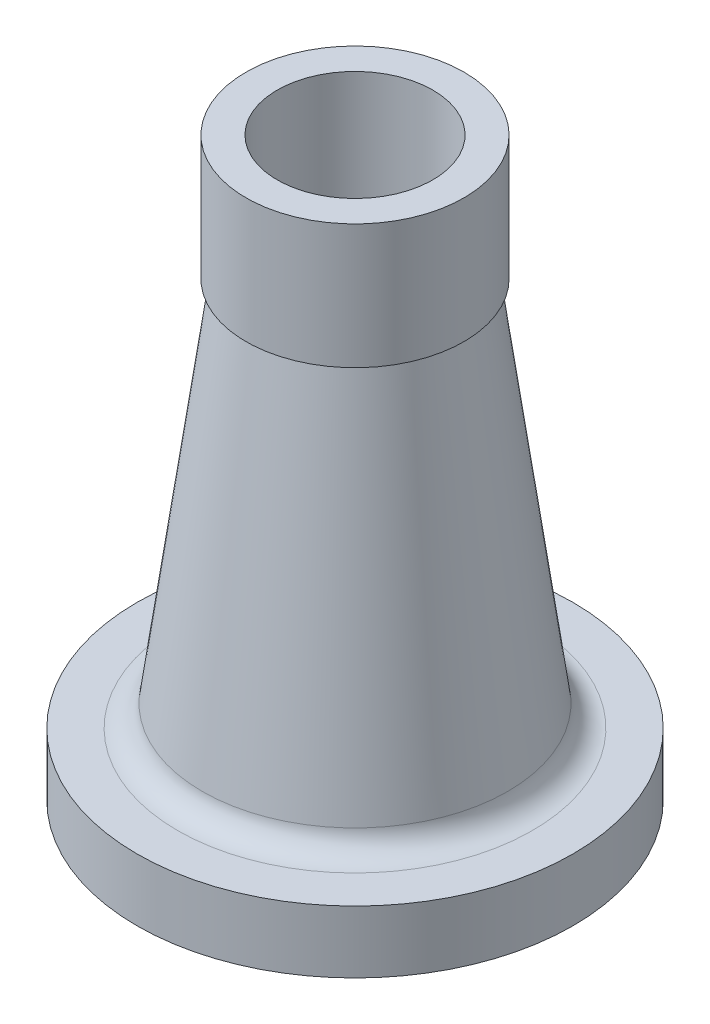
ISO-10303-21;
HEADER;
FILE_DESCRIPTION(('STEP AP214'),'2;1');
FILE_NAME('part.step','',(''),(''),'','','');
FILE_SCHEMA(('AUTOMOTIVE_DESIGN { 1 0 10303 214 1 1 1 1 }'));
ENDSEC;
DATA;
#1=APPLICATION_CONTEXT('core data for automotive mechanical design processes');
#2=APPLICATION_PROTOCOL_DEFINITION('international standard','automotive_design',2000,#1);
#3=PRODUCT_CONTEXT('',#1,'mechanical');
#4=PRODUCT('Part','Part','',(#3));
#5=PRODUCT_RELATED_PRODUCT_CATEGORY('part','',(#4));
#6=PRODUCT_DEFINITION_FORMATION('','',#4);
#7=PRODUCT_DEFINITION_CONTEXT('part definition',#1,'design');
#8=PRODUCT_DEFINITION('design','',#6,#7);
#9=PRODUCT_DEFINITION_SHAPE('','',#8);
#10=(LENGTH_UNIT() NAMED_UNIT(*) SI_UNIT(.MILLI.,.METRE.));
#11=(NAMED_UNIT(*) PLANE_ANGLE_UNIT() SI_UNIT($,.RADIAN.));
#12=(NAMED_UNIT(*) SI_UNIT($,.STERADIAN.) SOLID_ANGLE_UNIT());
#13=UNCERTAINTY_MEASURE_WITH_UNIT(LENGTH_MEASURE(1.E-05),#10,'distance_accuracy_value','');
#14=(GEOMETRIC_REPRESENTATION_CONTEXT(3) GLOBAL_UNCERTAINTY_ASSIGNED_CONTEXT((#13)) GLOBAL_UNIT_ASSIGNED_CONTEXT((#10,
#11,#12)) REPRESENTATION_CONTEXT('',''));
#15=CARTESIAN_POINT('',(0.,0.,0.));
#16=DIRECTION('',(0.,0.,1.));
#17=DIRECTION('',(1.,0.,0.));
#18=AXIS2_PLACEMENT_3D('',#15,#16,#17);
#19=CARTESIAN_POINT('',(0.,0.,0.));
#20=DIRECTION('',(0.,-1.,0.));
#21=DIRECTION('',(0.,0.,-1.));
#22=AXIS2_PLACEMENT_3D('',#19,#20,#21);
#23=CYLINDRICAL_SURFACE('',#22,50.);
#24=CARTESIAN_POINT('',(0.,0.,0.));
#25=DIRECTION('',(0.,-1.,0.));
#26=DIRECTION('',(0.,0.,-1.));
#27=AXIS2_PLACEMENT_3D('',#24,#25,#26);
#28=CIRCLE('',#27,50.);
#29=CARTESIAN_POINT('',(0.,0.,-50.));
#30=VERTEX_POINT('',#29);
#31=EDGE_CURVE('E56',#30,#30,#28,.T.);
#32=ORIENTED_EDGE('',*,*,#31,.T.);
#33=EDGE_LOOP('',(#32));
#34=FACE_BOUND('',#33,.T.);
#35=CARTESIAN_POINT('',(0.,3.,0.));
#36=DIRECTION('',(0.,-1.,0.));
#37=DIRECTION('',(0.,0.,-1.));
#38=AXIS2_PLACEMENT_3D('',#35,#36,#37);
#39=CIRCLE('',#38,50.);
#40=CARTESIAN_POINT('',(0.,3.,-50.));
#41=VERTEX_POINT('',#40);
#42=EDGE_CURVE('E95',#41,#41,#39,.T.);
#43=ORIENTED_EDGE('',*,*,#42,.F.);
#44=EDGE_LOOP('',(#43));
#45=FACE_BOUND('',#44,.T.);
#46=ADVANCED_FACE('F43',(#34,#45),#23,.F.);
#47=CARTESIAN_POINT('',(50.,0.,0.));
#48=DIRECTION('',(0.,-1.,0.));
#49=DIRECTION('',(0.,0.,-1.));
#50=AXIS2_PLACEMENT_3D('',#47,#48,#49);
#51=PLANE('',#50);
#52=CARTESIAN_POINT('',(0.,0.,0.));
#53=DIRECTION('',(0.,-1.,0.));
#54=DIRECTION('',(0.,0.,-1.));
#55=AXIS2_PLACEMENT_3D('',#52,#53,#54);
#56=CIRCLE('',#55,70.);
#57=CARTESIAN_POINT('',(0.,0.,-70.));
#58=VERTEX_POINT('',#57);
#59=EDGE_CURVE('E61',#58,#58,#56,.T.);
#60=ORIENTED_EDGE('',*,*,#59,.T.);
#61=EDGE_LOOP('',(#60));
#62=FACE_BOUND('',#61,.T.);
#63=ORIENTED_EDGE('',*,*,#31,.F.);
#64=EDGE_LOOP('',(#63));
#65=FACE_BOUND('',#64,.T.);
#66=ADVANCED_FACE('F104',(#62,#65),#51,.T.);
#67=CARTESIAN_POINT('',(0.,0.,0.));
#68=DIRECTION('',(0.,-1.,0.));
#69=DIRECTION('',(0.,0.,-1.));
#70=AXIS2_PLACEMENT_3D('',#67,#68,#69);
#71=CYLINDRICAL_SURFACE('',#70,70.);
#72=CARTESIAN_POINT('',(0.,20.,0.));
#73=DIRECTION('',(0.,-1.,0.));
#74=DIRECTION('',(0.,0.,-1.));
#75=AXIS2_PLACEMENT_3D('',#72,#73,#74);
#76=CIRCLE('',#75,70.);
#77=CARTESIAN_POINT('',(0.,20.,-70.));
#78=VERTEX_POINT('',#77);
#79=EDGE_CURVE('E67',#78,#78,#76,.T.);
#80=ORIENTED_EDGE('',*,*,#79,.T.);
#81=EDGE_LOOP('',(#80));
#82=FACE_BOUND('',#81,.T.);
#83=ORIENTED_EDGE('',*,*,#59,.F.);
#84=EDGE_LOOP('',(#83));
#85=FACE_BOUND('',#84,.T.);
#86=ADVANCED_FACE('F109',(#82,#85),#71,.T.);
#87=CARTESIAN_POINT('',(70.,20.,0.));
#88=DIRECTION('',(0.,1.,0.));
#89=DIRECTION('',(0.,0.,1.));
#90=AXIS2_PLACEMENT_3D('',#87,#88,#89);
#91=PLANE('',#90);
#92=CARTESIAN_POINT('',(0.,20.,0.));
#93=DIRECTION('',(0.,1.,0.));
#94=DIRECTION('',(0.,0.,1.));
#95=AXIS2_PLACEMENT_3D('',#92,#93,#94);
#96=CIRCLE('',#95,56.9856450256374);
#97=CARTESIAN_POINT('',(0.,20.,56.9856450256374));
#98=VERTEX_POINT('',#97);
#99=EDGE_CURVE('E51',#98,#98,#96,.F.);
#100=ORIENTED_EDGE('',*,*,#99,.T.);
#101=EDGE_LOOP('',(#100));
#102=FACE_BOUND('',#101,.T.);
#103=ORIENTED_EDGE('',*,*,#79,.F.);
#104=EDGE_LOOP('',(#103));
#105=FACE_BOUND('',#104,.T.);
#106=ADVANCED_FACE('F115',(#102,#105),#91,.T.);
#107=CARTESIAN_POINT('',(0.,20.,0.));
#108=DIRECTION('',(0.,-1.,0.));
#109=DIRECTION('',(0.,0.,-1.));
#110=AXIS2_PLACEMENT_3D('',#107,#108,#109);
#111=CONICAL_SURFACE('',#110,50.,0.135170698649009);
#112=CARTESIAN_POINT('',(0.,26.9219243634863,0.));
#113=DIRECTION('',(0.,-1.,0.));
#114=DIRECTION('',(0.,0.,-1.));
#115=AXIS2_PLACEMENT_3D('',#112,#113,#114);
#116=CIRCLE('',#115,49.0586182865659);
#117=CARTESIAN_POINT('',(0.,26.9219243634863,-49.0586182865659));
#118=VERTEX_POINT('',#117);
#119=EDGE_CURVE('E10',#118,#118,#116,.F.);
#120=ORIENTED_EDGE('',*,*,#119,.T.);
#121=EDGE_LOOP('',(#120));
#122=FACE_BOUND('',#121,.T.);
#123=CARTESIAN_POINT('',(0.,145.,0.));
#124=DIRECTION('',(0.,-1.,0.));
#125=DIRECTION('',(0.,0.,-1.));
#126=AXIS2_PLACEMENT_3D('',#123,#124,#125);
#127=CIRCLE('',#126,33.);
#128=CARTESIAN_POINT('',(0.,145.,-33.));
#129=VERTEX_POINT('',#128);
#130=EDGE_CURVE('E71',#129,#129,#127,.T.);
#131=ORIENTED_EDGE('',*,*,#130,.T.);
#132=EDGE_LOOP('',(#131));
#133=FACE_BOUND('',#132,.T.);
#134=ADVANCED_FACE('F119',(#122,#133),#111,.T.);
#135=CARTESIAN_POINT('',(33.,145.,0.));
#136=DIRECTION('',(0.,-1.,0.));
#137=DIRECTION('',(0.,0.,-1.));
#138=AXIS2_PLACEMENT_3D('',#135,#136,#137);
#139=PLANE('',#138);
#140=CARTESIAN_POINT('',(0.,145.,0.));
#141=DIRECTION('',(0.,-1.,0.));
#142=DIRECTION('',(0.,0.,-1.));
#143=AXIS2_PLACEMENT_3D('',#140,#141,#142);
#144=CIRCLE('',#143,35.);
#145=CARTESIAN_POINT('',(0.,145.,-35.));
#146=VERTEX_POINT('',#145);
#147=EDGE_CURVE('E75',#146,#146,#144,.T.);
#148=ORIENTED_EDGE('',*,*,#147,.T.);
#149=EDGE_LOOP('',(#148));
#150=FACE_BOUND('',#149,.T.);
#151=ORIENTED_EDGE('',*,*,#130,.F.);
#152=EDGE_LOOP('',(#151));
#153=FACE_BOUND('',#152,.T.);
#154=ADVANCED_FACE('F122',(#150,#153),#139,.T.);
#155=CARTESIAN_POINT('',(0.,0.,0.));
#156=DIRECTION('',(0.,-1.,0.));
#157=DIRECTION('',(0.,0.,-1.));
#158=AXIS2_PLACEMENT_3D('',#155,#156,#157);
#159=CYLINDRICAL_SURFACE('',#158,35.);
#160=CARTESIAN_POINT('',(0.,185.,0.));
#161=DIRECTION('',(0.,-1.,0.));
#162=DIRECTION('',(0.,0.,-1.));
#163=AXIS2_PLACEMENT_3D('',#160,#161,#162);
#164=CIRCLE('',#163,35.);
#165=CARTESIAN_POINT('',(0.,185.,-35.));
#166=VERTEX_POINT('',#165);
#167=EDGE_CURVE('E79',#166,#166,#164,.T.);
#168=ORIENTED_EDGE('',*,*,#167,.T.);
#169=EDGE_LOOP('',(#168));
#170=FACE_BOUND('',#169,.T.);
#171=ORIENTED_EDGE('',*,*,#147,.F.);
#172=EDGE_LOOP('',(#171));
#173=FACE_BOUND('',#172,.T.);
#174=ADVANCED_FACE('F125',(#170,#173),#159,.T.);
#175=CARTESIAN_POINT('',(35.,185.,0.));
#176=DIRECTION('',(0.,1.,0.));
#177=DIRECTION('',(0.,0.,1.));
#178=AXIS2_PLACEMENT_3D('',#175,#176,#177);
#179=PLANE('',#178);
#180=CARTESIAN_POINT('',(0.,185.,0.));
#181=DIRECTION('',(0.,-1.,0.));
#182=DIRECTION('',(0.,0.,-1.));
#183=AXIS2_PLACEMENT_3D('',#180,#181,#182);
#184=CIRCLE('',#183,25.);
#185=CARTESIAN_POINT('',(0.,185.,-25.));
#186=VERTEX_POINT('',#185);
#187=EDGE_CURVE('E83',#186,#186,#184,.T.);
#188=ORIENTED_EDGE('',*,*,#187,.T.);
#189=EDGE_LOOP('',(#188));
#190=FACE_BOUND('',#189,.T.);
#191=ORIENTED_EDGE('',*,*,#167,.F.);
#192=EDGE_LOOP('',(#191));
#193=FACE_BOUND('',#192,.T.);
#194=ADVANCED_FACE('F129',(#190,#193),#179,.T.);
#195=CARTESIAN_POINT('',(0.,0.,0.));
#196=DIRECTION('',(0.,-1.,0.));
#197=DIRECTION('',(0.,0.,-1.));
#198=AXIS2_PLACEMENT_3D('',#195,#196,#197);
#199=CYLINDRICAL_SURFACE('',#198,25.);
#200=CARTESIAN_POINT('',(0.,129.617233220244,0.));
#201=DIRECTION('',(0.,-1.,0.));
#202=DIRECTION('',(0.,0.,-1.));
#203=AXIS2_PLACEMENT_3D('',#200,#201,#202);
#204=CIRCLE('',#203,25.);
#205=CARTESIAN_POINT('',(0.,129.617233220244,-25.));
#206=VERTEX_POINT('',#205);
#207=EDGE_CURVE('E87',#206,#206,#204,.T.);
#208=ORIENTED_EDGE('',*,*,#207,.T.);
#209=EDGE_LOOP('',(#208));
#210=FACE_BOUND('',#209,.T.);
#211=ORIENTED_EDGE('',*,*,#187,.F.);
#212=EDGE_LOOP('',(#211));
#213=FACE_BOUND('',#212,.T.);
#214=ADVANCED_FACE('F133',(#210,#213),#199,.F.);
#215=CARTESIAN_POINT('',(0.,129.617233220244,0.));
#216=DIRECTION('',(0.,-1.,0.));
#217=DIRECTION('',(0.,0.,-1.));
#218=AXIS2_PLACEMENT_3D('',#215,#216,#217);
#219=CONICAL_SURFACE('',#218,25.,0.135170698649009);
#220=CARTESIAN_POINT('',(0.,3.,0.));
#221=DIRECTION('',(0.,-1.,0.));
#222=DIRECTION('',(0.,0.,-1.));
#223=AXIS2_PLACEMENT_3D('',#220,#221,#222);
#224=CIRCLE('',#223,42.2199437179532);
#225=CARTESIAN_POINT('',(0.,3.,-42.2199437179532));
#226=VERTEX_POINT('',#225);
#227=EDGE_CURVE('E91',#226,#226,#224,.T.);
#228=ORIENTED_EDGE('',*,*,#227,.T.);
#229=EDGE_LOOP('',(#228));
#230=FACE_BOUND('',#229,.T.);
#231=ORIENTED_EDGE('',*,*,#207,.F.);
#232=EDGE_LOOP('',(#231));
#233=FACE_BOUND('',#232,.T.);
#234=ADVANCED_FACE('F137',(#230,#233),#219,.F.);
#235=CARTESIAN_POINT('',(42.2199437179532,3.,0.));
#236=DIRECTION('',(0.,-1.,0.));
#237=DIRECTION('',(0.,0.,-1.));
#238=AXIS2_PLACEMENT_3D('',#235,#236,#237);
#239=PLANE('',#238);
#240=ORIENTED_EDGE('',*,*,#42,.T.);
#241=EDGE_LOOP('',(#240));
#242=FACE_BOUND('',#241,.T.);
#243=ORIENTED_EDGE('',*,*,#227,.F.);
#244=EDGE_LOOP('',(#243));
#245=FACE_BOUND('',#244,.T.);
#246=ADVANCED_FACE('F100',(#242,#245),#239,.T.);
#247=CARTESIAN_POINT('',(0.,28.,0.));
#248=DIRECTION('',(0.,1.,0.));
#249=DIRECTION('',(0.,0.,1.));
#250=AXIS2_PLACEMENT_3D('',#247,#248,#249);
#251=TOROIDAL_SURFACE('',#250,56.9856450256374,8.);
#252=ORIENTED_EDGE('',*,*,#119,.F.);
#253=EDGE_LOOP('',(#252));
#254=FACE_BOUND('',#253,.T.);
#255=ORIENTED_EDGE('',*,*,#99,.F.);
#256=EDGE_LOOP('',(#255));
#257=FACE_BOUND('',#256,.T.);
#258=ADVANCED_FACE('F45',(#254,#257),#251,.F.);
#259=CLOSED_SHELL('',(#46,#66,#86,#106,#134,#154,#174,#194,#214,#234,#246,#258));
#260=MANIFOLD_SOLID_BREP('B2',#259);
#261=ADVANCED_BREP_SHAPE_REPRESENTATION('',(#18,#260),#14);
#262=SHAPE_DEFINITION_REPRESENTATION(#9,#261);
ENDSEC;
END-ISO-10303-21;
